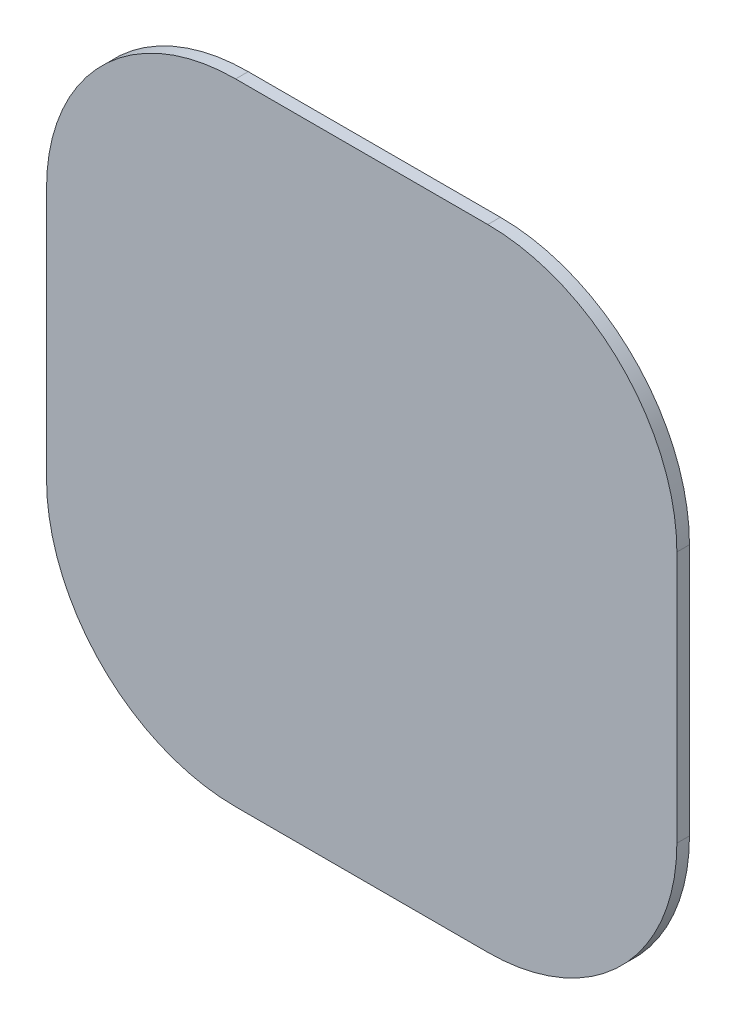
ISO-10303-21;
HEADER;
FILE_DESCRIPTION(('STEP AP214'),'2;1');
FILE_NAME('part.step','',(''),(''),'','','');
FILE_SCHEMA(('AUTOMOTIVE_DESIGN { 1 0 10303 214 1 1 1 1 }'));
ENDSEC;
DATA;
#1=APPLICATION_CONTEXT('core data for automotive mechanical design processes');
#2=APPLICATION_PROTOCOL_DEFINITION('international standard','automotive_design',2000,#1);
#3=PRODUCT_CONTEXT('',#1,'mechanical');
#4=PRODUCT('Part','Part','',(#3));
#5=PRODUCT_RELATED_PRODUCT_CATEGORY('part','',(#4));
#6=PRODUCT_DEFINITION_FORMATION('','',#4);
#7=PRODUCT_DEFINITION_CONTEXT('part definition',#1,'design');
#8=PRODUCT_DEFINITION('design','',#6,#7);
#9=PRODUCT_DEFINITION_SHAPE('','',#8);
#10=(LENGTH_UNIT() NAMED_UNIT(*) SI_UNIT(.MILLI.,.METRE.));
#11=(NAMED_UNIT(*) PLANE_ANGLE_UNIT() SI_UNIT($,.RADIAN.));
#12=(NAMED_UNIT(*) SI_UNIT($,.STERADIAN.) SOLID_ANGLE_UNIT());
#13=UNCERTAINTY_MEASURE_WITH_UNIT(LENGTH_MEASURE(1.E-05),#10,'distance_accuracy_value','');
#14=(GEOMETRIC_REPRESENTATION_CONTEXT(3) GLOBAL_UNCERTAINTY_ASSIGNED_CONTEXT((#13)) GLOBAL_UNIT_ASSIGNED_CONTEXT((#10,
#11,#12)) REPRESENTATION_CONTEXT('',''));
#15=CARTESIAN_POINT('',(0.,0.,0.));
#16=DIRECTION('',(0.,0.,1.));
#17=DIRECTION('',(1.,0.,0.));
#18=AXIS2_PLACEMENT_3D('',#15,#16,#17);
#19=CARTESIAN_POINT('',(-30.,8.49999999999998,3.));
#20=DIRECTION('',(0.,0.,-1.));
#21=DIRECTION('',(-1.,0.,0.));
#22=AXIS2_PLACEMENT_3D('',#19,#20,#21);
#23=CYLINDRICAL_SURFACE('',#22,45.);
#24=CARTESIAN_POINT('',(-30.,8.49999999999998,0.));
#25=DIRECTION('',(0.,0.,1.));
#26=DIRECTION('',(-1.,0.,0.));
#27=AXIS2_PLACEMENT_3D('',#24,#25,#26);
#28=CIRCLE('',#27,45.);
#29=CARTESIAN_POINT('',(-30.,53.5,0.));
#30=VERTEX_POINT('',#29);
#31=CARTESIAN_POINT('',(-75.,8.49999999999997,0.));
#32=VERTEX_POINT('',#31);
#33=EDGE_CURVE('E133',#30,#32,#28,.T.);
#34=ORIENTED_EDGE('',*,*,#33,.T.);
#35=DIRECTION('',(0.,0.,-1.));
#36=VECTOR('',#35,1.);
#37=CARTESIAN_POINT('',(-75.,8.49999999999997,3.));
#38=LINE('',#37,#36);
#39=CARTESIAN_POINT('',(-75.,8.49999999999997,3.));
#40=VERTEX_POINT('',#39);
#41=EDGE_CURVE('E11',#40,#32,#38,.T.);
#42=ORIENTED_EDGE('',*,*,#41,.F.);
#43=CARTESIAN_POINT('',(-30.,8.49999999999998,3.));
#44=DIRECTION('',(0.,0.,1.));
#45=DIRECTION('',(-1.,0.,0.));
#46=AXIS2_PLACEMENT_3D('',#43,#44,#45);
#47=CIRCLE('',#46,45.);
#48=CARTESIAN_POINT('',(-30.,53.5,3.));
#49=VERTEX_POINT('',#48);
#50=EDGE_CURVE('E148',#49,#40,#47,.T.);
#51=ORIENTED_EDGE('',*,*,#50,.F.);
#52=DIRECTION('',(0.,0.,-1.));
#53=VECTOR('',#52,1.);
#54=CARTESIAN_POINT('',(-30.,53.5,3.));
#55=LINE('',#54,#53);
#56=EDGE_CURVE('E129',#49,#30,#55,.T.);
#57=ORIENTED_EDGE('',*,*,#56,.T.);
#58=EDGE_LOOP('',(#34,#42,#51,#57));
#59=FACE_BOUND('',#58,.T.);
#60=ADVANCED_FACE('F37',(#59),#23,.T.);
#61=CARTESIAN_POINT('',(-75.,8.49999999999997,3.));
#62=DIRECTION('',(1.,0.,0.));
#63=DIRECTION('',(0.,0.,-1.));
#64=AXIS2_PLACEMENT_3D('',#61,#62,#63);
#65=PLANE('',#64);
#66=DIRECTION('',(0.,-1.,0.));
#67=VECTOR('',#66,1.);
#68=CARTESIAN_POINT('',(-75.,8.49999999999997,0.));
#69=LINE('',#68,#67);
#70=CARTESIAN_POINT('',(-75.,-51.5,0.));
#71=VERTEX_POINT('',#70);
#72=EDGE_CURVE('E136',#32,#71,#69,.T.);
#73=ORIENTED_EDGE('',*,*,#72,.T.);
#74=DIRECTION('',(0.,0.,-1.));
#75=VECTOR('',#74,1.);
#76=CARTESIAN_POINT('',(-75.,-51.5,3.));
#77=LINE('',#76,#75);
#78=CARTESIAN_POINT('',(-75.,-51.5,3.));
#79=VERTEX_POINT('',#78);
#80=EDGE_CURVE('E45',#79,#71,#77,.T.);
#81=ORIENTED_EDGE('',*,*,#80,.F.);
#82=DIRECTION('',(0.,-1.,0.));
#83=VECTOR('',#82,1.);
#84=CARTESIAN_POINT('',(-75.,8.49999999999997,3.));
#85=LINE('',#84,#83);
#86=EDGE_CURVE('E96',#40,#79,#85,.T.);
#87=ORIENTED_EDGE('',*,*,#86,.F.);
#88=ORIENTED_EDGE('',*,*,#41,.T.);
#89=EDGE_LOOP('',(#73,#81,#87,#88));
#90=FACE_BOUND('',#89,.T.);
#91=ADVANCED_FACE('F182',(#90),#65,.F.);
#92=CARTESIAN_POINT('',(-30.,-51.5,3.));
#93=DIRECTION('',(0.,0.,-1.));
#94=DIRECTION('',(-1.,0.,0.));
#95=AXIS2_PLACEMENT_3D('',#92,#93,#94);
#96=CYLINDRICAL_SURFACE('',#95,45.);
#97=CARTESIAN_POINT('',(-30.,-51.5,0.));
#98=DIRECTION('',(0.,0.,1.));
#99=DIRECTION('',(1.,0.,0.));
#100=AXIS2_PLACEMENT_3D('',#97,#98,#99);
#101=CIRCLE('',#100,45.);
#102=CARTESIAN_POINT('',(-30.,-96.5,0.));
#103=VERTEX_POINT('',#102);
#104=EDGE_CURVE('E138',#71,#103,#101,.T.);
#105=ORIENTED_EDGE('',*,*,#104,.T.);
#106=DIRECTION('',(0.,0.,-1.));
#107=VECTOR('',#106,1.);
#108=CARTESIAN_POINT('',(-30.,-96.5,3.));
#109=LINE('',#108,#107);
#110=CARTESIAN_POINT('',(-30.,-96.5,3.));
#111=VERTEX_POINT('',#110);
#112=EDGE_CURVE('E155',#111,#103,#109,.T.);
#113=ORIENTED_EDGE('',*,*,#112,.F.);
#114=CARTESIAN_POINT('',(-30.,-51.5,3.));
#115=DIRECTION('',(0.,0.,1.));
#116=DIRECTION('',(1.,0.,0.));
#117=AXIS2_PLACEMENT_3D('',#114,#115,#116);
#118=CIRCLE('',#117,45.);
#119=EDGE_CURVE('E163',#79,#111,#118,.T.);
#120=ORIENTED_EDGE('',*,*,#119,.F.);
#121=ORIENTED_EDGE('',*,*,#80,.T.);
#122=EDGE_LOOP('',(#105,#113,#120,#121));
#123=FACE_BOUND('',#122,.T.);
#124=ADVANCED_FACE('F161',(#123),#96,.T.);
#125=CARTESIAN_POINT('',(0.500000000000052,-96.5,3.));
#126=DIRECTION('',(0.,1.,0.));
#127=DIRECTION('',(-1.,0.,0.));
#128=AXIS2_PLACEMENT_3D('',#125,#126,#127);
#129=PLANE('',#128);
#130=DIRECTION('',(1.,0.,0.));
#131=VECTOR('',#130,1.);
#132=CARTESIAN_POINT('',(0.500000000000052,-96.5,0.));
#133=LINE('',#132,#131);
#134=CARTESIAN_POINT('',(30.,-96.5,0.));
#135=VERTEX_POINT('',#134);
#136=EDGE_CURVE('E141',#103,#135,#133,.T.);
#137=ORIENTED_EDGE('',*,*,#136,.T.);
#138=DIRECTION('',(0.,0.,-1.));
#139=VECTOR('',#138,1.);
#140=CARTESIAN_POINT('',(30.,-96.5,3.));
#141=LINE('',#140,#139);
#142=CARTESIAN_POINT('',(30.,-96.5,3.));
#143=VERTEX_POINT('',#142);
#144=EDGE_CURVE('E152',#143,#135,#141,.T.);
#145=ORIENTED_EDGE('',*,*,#144,.F.);
#146=DIRECTION('',(1.,0.,0.));
#147=VECTOR('',#146,1.);
#148=CARTESIAN_POINT('',(-30.,-96.5,3.));
#149=LINE('',#148,#147);
#150=EDGE_CURVE('E174',#111,#143,#149,.T.);
#151=ORIENTED_EDGE('',*,*,#150,.F.);
#152=ORIENTED_EDGE('',*,*,#112,.T.);
#153=EDGE_LOOP('',(#137,#145,#151,#152));
#154=FACE_BOUND('',#153,.T.);
#155=ADVANCED_FACE('F170',(#154),#129,.F.);
#156=CARTESIAN_POINT('',(30.,-51.5,3.));
#157=DIRECTION('',(0.,0.,-1.));
#158=DIRECTION('',(-1.,0.,0.));
#159=AXIS2_PLACEMENT_3D('',#156,#157,#158);
#160=CYLINDRICAL_SURFACE('',#159,45.);
#161=CARTESIAN_POINT('',(30.,-51.5,0.));
#162=DIRECTION('',(0.,0.,1.));
#163=DIRECTION('',(1.,0.,0.));
#164=AXIS2_PLACEMENT_3D('',#161,#162,#163);
#165=CIRCLE('',#164,45.);
#166=CARTESIAN_POINT('',(75.,-51.5,0.));
#167=VERTEX_POINT('',#166);
#168=EDGE_CURVE('E143',#135,#167,#165,.T.);
#169=ORIENTED_EDGE('',*,*,#168,.T.);
#170=DIRECTION('',(0.,0.,-1.));
#171=VECTOR('',#170,1.);
#172=CARTESIAN_POINT('',(75.,-51.5,3.));
#173=LINE('',#172,#171);
#174=CARTESIAN_POINT('',(75.,-51.5,3.));
#175=VERTEX_POINT('',#174);
#176=EDGE_CURVE('E124',#175,#167,#173,.T.);
#177=ORIENTED_EDGE('',*,*,#176,.F.);
#178=CARTESIAN_POINT('',(30.,-51.5,3.));
#179=DIRECTION('',(0.,0.,1.));
#180=DIRECTION('',(1.,0.,0.));
#181=AXIS2_PLACEMENT_3D('',#178,#179,#180);
#182=CIRCLE('',#181,45.);
#183=EDGE_CURVE('E115',#143,#175,#182,.T.);
#184=ORIENTED_EDGE('',*,*,#183,.F.);
#185=ORIENTED_EDGE('',*,*,#144,.T.);
#186=EDGE_LOOP('',(#169,#177,#184,#185));
#187=FACE_BOUND('',#186,.T.);
#188=ADVANCED_FACE('F173',(#187),#160,.T.);
#189=CARTESIAN_POINT('',(75.,8.49999999999999,3.));
#190=DIRECTION('',(-1.,0.,0.));
#191=DIRECTION('',(0.,0.,1.));
#192=AXIS2_PLACEMENT_3D('',#189,#190,#191);
#193=PLANE('',#192);
#194=DIRECTION('',(0.,1.,0.));
#195=VECTOR('',#194,1.);
#196=CARTESIAN_POINT('',(75.,8.49999999999999,0.));
#197=LINE('',#196,#195);
#198=CARTESIAN_POINT('',(75.,8.49999999999999,0.));
#199=VERTEX_POINT('',#198);
#200=EDGE_CURVE('E123',#167,#199,#197,.T.);
#201=ORIENTED_EDGE('',*,*,#200,.T.);
#202=DIRECTION('',(0.,0.,-1.));
#203=VECTOR('',#202,1.);
#204=CARTESIAN_POINT('',(75.,8.49999999999999,3.));
#205=LINE('',#204,#203);
#206=CARTESIAN_POINT('',(75.,8.49999999999999,3.));
#207=VERTEX_POINT('',#206);
#208=EDGE_CURVE('E120',#207,#199,#205,.T.);
#209=ORIENTED_EDGE('',*,*,#208,.F.);
#210=DIRECTION('',(0.,1.,0.));
#211=VECTOR('',#210,1.);
#212=CARTESIAN_POINT('',(75.,8.49999999999999,3.));
#213=LINE('',#212,#211);
#214=EDGE_CURVE('E109',#175,#207,#213,.T.);
#215=ORIENTED_EDGE('',*,*,#214,.F.);
#216=ORIENTED_EDGE('',*,*,#176,.T.);
#217=EDGE_LOOP('',(#201,#209,#215,#216));
#218=FACE_BOUND('',#217,.T.);
#219=ADVANCED_FACE('F121',(#218),#193,.F.);
#220=CARTESIAN_POINT('',(30.,8.49999999999999,3.));
#221=DIRECTION('',(0.,0.,-1.));
#222=DIRECTION('',(-1.,0.,0.));
#223=AXIS2_PLACEMENT_3D('',#220,#221,#222);
#224=CYLINDRICAL_SURFACE('',#223,45.);
#225=CARTESIAN_POINT('',(30.,8.49999999999999,0.));
#226=DIRECTION('',(0.,0.,1.));
#227=DIRECTION('',(-1.,0.,0.));
#228=AXIS2_PLACEMENT_3D('',#225,#226,#227);
#229=CIRCLE('',#228,45.);
#230=CARTESIAN_POINT('',(30.,53.5,0.));
#231=VERTEX_POINT('',#230);
#232=EDGE_CURVE('E82',#199,#231,#229,.T.);
#233=ORIENTED_EDGE('',*,*,#232,.T.);
#234=DIRECTION('',(0.,0.,-1.));
#235=VECTOR('',#234,1.);
#236=CARTESIAN_POINT('',(30.,53.5,3.));
#237=LINE('',#236,#235);
#238=CARTESIAN_POINT('',(30.,53.5,3.));
#239=VERTEX_POINT('',#238);
#240=EDGE_CURVE('E125',#239,#231,#237,.T.);
#241=ORIENTED_EDGE('',*,*,#240,.F.);
#242=CARTESIAN_POINT('',(30.,8.49999999999999,3.));
#243=DIRECTION('',(0.,0.,1.));
#244=DIRECTION('',(-1.,0.,0.));
#245=AXIS2_PLACEMENT_3D('',#242,#243,#244);
#246=CIRCLE('',#245,45.);
#247=EDGE_CURVE('E113',#207,#239,#246,.T.);
#248=ORIENTED_EDGE('',*,*,#247,.F.);
#249=ORIENTED_EDGE('',*,*,#208,.T.);
#250=EDGE_LOOP('',(#233,#241,#248,#249));
#251=FACE_BOUND('',#250,.T.);
#252=ADVANCED_FACE('F127',(#251),#224,.T.);
#253=CARTESIAN_POINT('',(-30.,53.5,3.));
#254=DIRECTION('',(0.,-1.,0.));
#255=DIRECTION('',(1.,0.,0.));
#256=AXIS2_PLACEMENT_3D('',#253,#254,#255);
#257=PLANE('',#256);
#258=DIRECTION('',(-1.,0.,0.));
#259=VECTOR('',#258,1.);
#260=CARTESIAN_POINT('',(-30.,53.5,0.));
#261=LINE('',#260,#259);
#262=EDGE_CURVE('E88',#231,#30,#261,.T.);
#263=ORIENTED_EDGE('',*,*,#262,.T.);
#264=ORIENTED_EDGE('',*,*,#56,.F.);
#265=DIRECTION('',(-1.,0.,0.));
#266=VECTOR('',#265,1.);
#267=CARTESIAN_POINT('',(-30.,53.5,3.));
#268=LINE('',#267,#266);
#269=EDGE_CURVE('E53',#239,#49,#268,.T.);
#270=ORIENTED_EDGE('',*,*,#269,.F.);
#271=ORIENTED_EDGE('',*,*,#240,.T.);
#272=EDGE_LOOP('',(#263,#264,#270,#271));
#273=FACE_BOUND('',#272,.T.);
#274=ADVANCED_FACE('F198',(#273),#257,.F.);
#275=CARTESIAN_POINT('',(-30.,8.49999999999998,3.));
#276=DIRECTION('',(0.,0.,-1.));
#277=DIRECTION('',(-1.,0.,0.));
#278=AXIS2_PLACEMENT_3D('',#275,#276,#277);
#279=PLANE('',#278);
#280=ORIENTED_EDGE('',*,*,#50,.T.);
#281=ORIENTED_EDGE('',*,*,#86,.T.);
#282=ORIENTED_EDGE('',*,*,#119,.T.);
#283=ORIENTED_EDGE('',*,*,#150,.T.);
#284=ORIENTED_EDGE('',*,*,#183,.T.);
#285=ORIENTED_EDGE('',*,*,#214,.T.);
#286=ORIENTED_EDGE('',*,*,#247,.T.);
#287=ORIENTED_EDGE('',*,*,#269,.T.);
#288=EDGE_LOOP('',(#280,#281,#282,#283,#284,#285,#286,#287));
#289=FACE_BOUND('',#288,.T.);
#290=ADVANCED_FACE('F111',(#289),#279,.F.);
#291=CARTESIAN_POINT('',(-30.,8.49999999999998,0.));
#292=DIRECTION('',(0.,0.,-1.));
#293=DIRECTION('',(-1.,0.,0.));
#294=AXIS2_PLACEMENT_3D('',#291,#292,#293);
#295=PLANE('',#294);
#296=ORIENTED_EDGE('',*,*,#33,.F.);
#297=ORIENTED_EDGE('',*,*,#262,.F.);
#298=ORIENTED_EDGE('',*,*,#232,.F.);
#299=ORIENTED_EDGE('',*,*,#200,.F.);
#300=ORIENTED_EDGE('',*,*,#168,.F.);
#301=ORIENTED_EDGE('',*,*,#136,.F.);
#302=ORIENTED_EDGE('',*,*,#104,.F.);
#303=ORIENTED_EDGE('',*,*,#72,.F.);
#304=EDGE_LOOP('',(#296,#297,#298,#299,#300,#301,#302,#303));
#305=FACE_BOUND('',#304,.T.);
#306=ADVANCED_FACE('F166',(#305),#295,.T.);
#307=CLOSED_SHELL('',(#60,#91,#124,#155,#188,#219,#252,#274,#290,#306));
#308=MANIFOLD_SOLID_BREP('B2',#307);
#309=ADVANCED_BREP_SHAPE_REPRESENTATION('',(#18,#308),#14);
#310=SHAPE_DEFINITION_REPRESENTATION(#9,#309);
ENDSEC;
END-ISO-10303-21;
